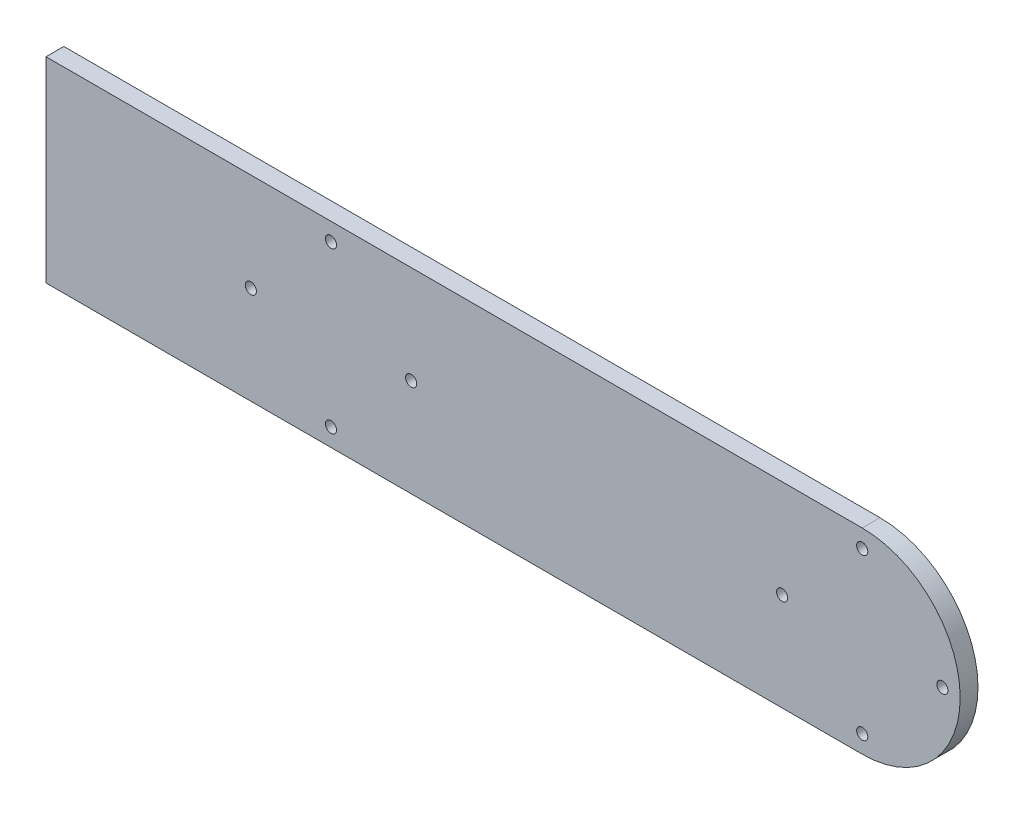
ISO-10303-21;
HEADER;
FILE_DESCRIPTION(('STEP AP214'),'2;1');
FILE_NAME('part.step','',(''),(''),'','','');
FILE_SCHEMA(('AUTOMOTIVE_DESIGN { 1 0 10303 214 1 1 1 1 }'));
ENDSEC;
DATA;
#1=APPLICATION_CONTEXT('core data for automotive mechanical design processes');
#2=APPLICATION_PROTOCOL_DEFINITION('international standard','automotive_design',2000,#1);
#3=PRODUCT_CONTEXT('',#1,'mechanical');
#4=PRODUCT('Part','Part','',(#3));
#5=PRODUCT_RELATED_PRODUCT_CATEGORY('part','',(#4));
#6=PRODUCT_DEFINITION_FORMATION('','',#4);
#7=PRODUCT_DEFINITION_CONTEXT('part definition',#1,'design');
#8=PRODUCT_DEFINITION('design','',#6,#7);
#9=PRODUCT_DEFINITION_SHAPE('','',#8);
#10=(LENGTH_UNIT() NAMED_UNIT(*) SI_UNIT(.MILLI.,.METRE.));
#11=(NAMED_UNIT(*) PLANE_ANGLE_UNIT() SI_UNIT($,.RADIAN.));
#12=(NAMED_UNIT(*) SI_UNIT($,.STERADIAN.) SOLID_ANGLE_UNIT());
#13=UNCERTAINTY_MEASURE_WITH_UNIT(LENGTH_MEASURE(1.E-05),#10,'distance_accuracy_value','');
#14=(GEOMETRIC_REPRESENTATION_CONTEXT(3) GLOBAL_UNCERTAINTY_ASSIGNED_CONTEXT((#13)) GLOBAL_UNIT_ASSIGNED_CONTEXT((#10,
#11,#12)) REPRESENTATION_CONTEXT('',''));
#15=CARTESIAN_POINT('',(0.,0.,0.));
#16=DIRECTION('',(0.,0.,1.));
#17=DIRECTION('',(1.,0.,0.));
#18=AXIS2_PLACEMENT_3D('',#15,#16,#17);
#19=CARTESIAN_POINT('',(0.,0.,5.));
#20=DIRECTION('',(0.,0.,-1.));
#21=DIRECTION('',(-1.,0.,0.));
#22=AXIS2_PLACEMENT_3D('',#19,#20,#21);
#23=PLANE('',#22);
#24=CARTESIAN_POINT('',(0.,0.,5.));
#25=DIRECTION('',(0.,0.,1.));
#26=DIRECTION('',(-1.,0.,0.));
#27=AXIS2_PLACEMENT_3D('',#24,#25,#26);
#28=CIRCLE('',#27,27.5);
#29=CARTESIAN_POINT('',(0.,-27.5,5.));
#30=VERTEX_POINT('',#29);
#31=CARTESIAN_POINT('',(0.,27.5,5.));
#32=VERTEX_POINT('',#31);
#33=EDGE_CURVE('E98',#30,#32,#28,.T.);
#34=ORIENTED_EDGE('',*,*,#33,.T.);
#35=DIRECTION('',(-1.,0.,0.));
#36=VECTOR('',#35,1.);
#37=CARTESIAN_POINT('',(0.,27.5,5.));
#38=LINE('',#37,#36);
#39=CARTESIAN_POINT('',(-229.132053391555,27.5,5.));
#40=VERTEX_POINT('',#39);
#41=EDGE_CURVE('E93',#32,#40,#38,.T.);
#42=ORIENTED_EDGE('',*,*,#41,.T.);
#43=DIRECTION('',(0.,-1.,0.));
#44=VECTOR('',#43,1.);
#45=CARTESIAN_POINT('',(-229.132053391555,27.5,5.));
#46=LINE('',#45,#44);
#47=CARTESIAN_POINT('',(-229.132053391555,-27.5,5.));
#48=VERTEX_POINT('',#47);
#49=EDGE_CURVE('E96',#40,#48,#46,.T.);
#50=ORIENTED_EDGE('',*,*,#49,.T.);
#51=DIRECTION('',(1.,0.,0.));
#52=VECTOR('',#51,1.);
#53=CARTESIAN_POINT('',(-229.132053391555,-27.5,5.));
#54=LINE('',#53,#52);
#55=EDGE_CURVE('E63',#48,#30,#54,.T.);
#56=ORIENTED_EDGE('',*,*,#55,.T.);
#57=EDGE_LOOP('',(#34,#42,#50,#56));
#58=FACE_BOUND('',#57,.T.);
#59=CARTESIAN_POINT('',(0.,22.5,5.));
#60=DIRECTION('',(0.,0.,1.));
#61=DIRECTION('',(1.,0.,0.));
#62=AXIS2_PLACEMENT_3D('',#59,#60,#61);
#63=CIRCLE('',#62,1.5635);
#64=CARTESIAN_POINT('',(1.5635,22.5,5.));
#65=VERTEX_POINT('',#64);
#66=EDGE_CURVE('E118',#65,#65,#63,.T.);
#67=ORIENTED_EDGE('',*,*,#66,.F.);
#68=EDGE_LOOP('',(#67));
#69=FACE_BOUND('',#68,.T.);
#70=CARTESIAN_POINT('',(22.5,0.,5.));
#71=DIRECTION('',(0.,0.,1.));
#72=DIRECTION('',(1.,0.,0.));
#73=AXIS2_PLACEMENT_3D('',#70,#71,#72);
#74=CIRCLE('',#73,1.5635);
#75=CARTESIAN_POINT('',(24.0635,0.,5.));
#76=VERTEX_POINT('',#75);
#77=EDGE_CURVE('E140',#76,#76,#74,.T.);
#78=ORIENTED_EDGE('',*,*,#77,.F.);
#79=EDGE_LOOP('',(#78));
#80=FACE_BOUND('',#79,.T.);
#81=CARTESIAN_POINT('',(0.,-22.5000000000001,5.));
#82=DIRECTION('',(0.,0.,1.));
#83=DIRECTION('',(1.,0.,0.));
#84=AXIS2_PLACEMENT_3D('',#81,#82,#83);
#85=CIRCLE('',#84,1.5635);
#86=CARTESIAN_POINT('',(1.56349999999992,-22.5000000000001,5.));
#87=VERTEX_POINT('',#86);
#88=EDGE_CURVE('E148',#87,#87,#85,.T.);
#89=ORIENTED_EDGE('',*,*,#88,.F.);
#90=EDGE_LOOP('',(#89));
#91=FACE_BOUND('',#90,.T.);
#92=CARTESIAN_POINT('',(-22.5000000000001,0.,5.));
#93=DIRECTION('',(0.,0.,1.));
#94=DIRECTION('',(1.,0.,0.));
#95=AXIS2_PLACEMENT_3D('',#92,#93,#94);
#96=CIRCLE('',#95,1.5635);
#97=CARTESIAN_POINT('',(-20.9365000000001,0.,5.));
#98=VERTEX_POINT('',#97);
#99=EDGE_CURVE('E156',#98,#98,#96,.T.);
#100=ORIENTED_EDGE('',*,*,#99,.F.);
#101=EDGE_LOOP('',(#100));
#102=FACE_BOUND('',#101,.T.);
#103=CARTESIAN_POINT('',(-149.132053391555,22.5,5.));
#104=DIRECTION('',(0.,0.,1.));
#105=DIRECTION('',(1.,0.,0.));
#106=AXIS2_PLACEMENT_3D('',#103,#104,#105);
#107=CIRCLE('',#106,1.5635);
#108=CARTESIAN_POINT('',(-147.568553391555,22.5,5.));
#109=VERTEX_POINT('',#108);
#110=EDGE_CURVE('E164',#109,#109,#107,.T.);
#111=ORIENTED_EDGE('',*,*,#110,.F.);
#112=EDGE_LOOP('',(#111));
#113=FACE_BOUND('',#112,.T.);
#114=CARTESIAN_POINT('',(-126.632053391555,0.,5.));
#115=DIRECTION('',(0.,0.,1.));
#116=DIRECTION('',(1.,0.,0.));
#117=AXIS2_PLACEMENT_3D('',#114,#115,#116);
#118=CIRCLE('',#117,1.5635);
#119=CARTESIAN_POINT('',(-125.068553391555,0.,5.));
#120=VERTEX_POINT('',#119);
#121=EDGE_CURVE('E172',#120,#120,#118,.T.);
#122=ORIENTED_EDGE('',*,*,#121,.F.);
#123=EDGE_LOOP('',(#122));
#124=FACE_BOUND('',#123,.T.);
#125=CARTESIAN_POINT('',(-149.132053391555,-22.5,5.));
#126=DIRECTION('',(0.,0.,1.));
#127=DIRECTION('',(1.,0.,0.));
#128=AXIS2_PLACEMENT_3D('',#125,#126,#127);
#129=CIRCLE('',#128,1.5635);
#130=CARTESIAN_POINT('',(-147.568553391555,-22.5,5.));
#131=VERTEX_POINT('',#130);
#132=EDGE_CURVE('E180',#131,#131,#129,.T.);
#133=ORIENTED_EDGE('',*,*,#132,.F.);
#134=EDGE_LOOP('',(#133));
#135=FACE_BOUND('',#134,.T.);
#136=CARTESIAN_POINT('',(-171.632053391555,0.,5.));
#137=DIRECTION('',(0.,0.,1.));
#138=DIRECTION('',(1.,0.,0.));
#139=AXIS2_PLACEMENT_3D('',#136,#137,#138);
#140=CIRCLE('',#139,1.5635);
#141=CARTESIAN_POINT('',(-170.068553391555,0.,5.));
#142=VERTEX_POINT('',#141);
#143=EDGE_CURVE('E188',#142,#142,#140,.T.);
#144=ORIENTED_EDGE('',*,*,#143,.F.);
#145=EDGE_LOOP('',(#144));
#146=FACE_BOUND('',#145,.T.);
#147=ADVANCED_FACE('F45',(#58,#69,#80,#91,#102,#113,#124,#135,#146),#23,.F.);
#148=CARTESIAN_POINT('',(0.,0.,0.));
#149=DIRECTION('',(0.,0.,-1.));
#150=DIRECTION('',(-1.,0.,0.));
#151=AXIS2_PLACEMENT_3D('',#148,#149,#150);
#152=PLANE('',#151);
#153=CARTESIAN_POINT('',(-149.132053391555,-22.5,0.));
#154=DIRECTION('',(0.,0.,1.));
#155=DIRECTION('',(1.,0.,0.));
#156=AXIS2_PLACEMENT_3D('',#153,#154,#155);
#157=CIRCLE('',#156,1.5635);
#158=CARTESIAN_POINT('',(-147.568553391555,-22.5,0.));
#159=VERTEX_POINT('',#158);
#160=EDGE_CURVE('E184',#159,#159,#157,.T.);
#161=ORIENTED_EDGE('',*,*,#160,.T.);
#162=EDGE_LOOP('',(#161));
#163=FACE_BOUND('',#162,.T.);
#164=CARTESIAN_POINT('',(-149.132053391555,22.5,0.));
#165=DIRECTION('',(0.,0.,1.));
#166=DIRECTION('',(1.,0.,0.));
#167=AXIS2_PLACEMENT_3D('',#164,#165,#166);
#168=CIRCLE('',#167,1.5635);
#169=CARTESIAN_POINT('',(-147.568553391555,22.5,0.));
#170=VERTEX_POINT('',#169);
#171=EDGE_CURVE('E168',#170,#170,#168,.T.);
#172=ORIENTED_EDGE('',*,*,#171,.T.);
#173=EDGE_LOOP('',(#172));
#174=FACE_BOUND('',#173,.T.);
#175=CARTESIAN_POINT('',(0.,-22.5000000000001,0.));
#176=DIRECTION('',(0.,0.,1.));
#177=DIRECTION('',(1.,0.,0.));
#178=AXIS2_PLACEMENT_3D('',#175,#176,#177);
#179=CIRCLE('',#178,1.5635);
#180=CARTESIAN_POINT('',(1.56349999999992,-22.5000000000001,0.));
#181=VERTEX_POINT('',#180);
#182=EDGE_CURVE('E152',#181,#181,#179,.T.);
#183=ORIENTED_EDGE('',*,*,#182,.T.);
#184=EDGE_LOOP('',(#183));
#185=FACE_BOUND('',#184,.T.);
#186=CARTESIAN_POINT('',(0.,22.5,0.));
#187=DIRECTION('',(0.,0.,1.));
#188=DIRECTION('',(1.,0.,0.));
#189=AXIS2_PLACEMENT_3D('',#186,#187,#188);
#190=CIRCLE('',#189,1.5635);
#191=CARTESIAN_POINT('',(1.5635,22.5,0.));
#192=VERTEX_POINT('',#191);
#193=EDGE_CURVE('E136',#192,#192,#190,.T.);
#194=ORIENTED_EDGE('',*,*,#193,.T.);
#195=EDGE_LOOP('',(#194));
#196=FACE_BOUND('',#195,.T.);
#197=CARTESIAN_POINT('',(0.,0.,0.));
#198=DIRECTION('',(0.,0.,1.));
#199=DIRECTION('',(-1.,0.,0.));
#200=AXIS2_PLACEMENT_3D('',#197,#198,#199);
#201=CIRCLE('',#200,27.5);
#202=CARTESIAN_POINT('',(0.,-27.5,0.));
#203=VERTEX_POINT('',#202);
#204=CARTESIAN_POINT('',(0.,27.5,0.));
#205=VERTEX_POINT('',#204);
#206=EDGE_CURVE('E114',#203,#205,#201,.T.);
#207=ORIENTED_EDGE('',*,*,#206,.F.);
#208=DIRECTION('',(1.,0.,0.));
#209=VECTOR('',#208,1.);
#210=CARTESIAN_POINT('',(-229.132053391555,-27.5,0.));
#211=LINE('',#210,#209);
#212=CARTESIAN_POINT('',(-229.132053391555,-27.5,0.));
#213=VERTEX_POINT('',#212);
#214=EDGE_CURVE('E86',#213,#203,#211,.T.);
#215=ORIENTED_EDGE('',*,*,#214,.F.);
#216=DIRECTION('',(0.,-1.,0.));
#217=VECTOR('',#216,1.);
#218=CARTESIAN_POINT('',(-229.132053391555,27.5,0.));
#219=LINE('',#218,#217);
#220=CARTESIAN_POINT('',(-229.132053391555,27.5,0.));
#221=VERTEX_POINT('',#220);
#222=EDGE_CURVE('E80',#221,#213,#219,.T.);
#223=ORIENTED_EDGE('',*,*,#222,.F.);
#224=DIRECTION('',(-1.,0.,0.));
#225=VECTOR('',#224,1.);
#226=CARTESIAN_POINT('',(0.,27.5,0.));
#227=LINE('',#226,#225);
#228=EDGE_CURVE('E103',#205,#221,#227,.T.);
#229=ORIENTED_EDGE('',*,*,#228,.F.);
#230=EDGE_LOOP('',(#207,#215,#223,#229));
#231=FACE_BOUND('',#230,.T.);
#232=CARTESIAN_POINT('',(22.5,0.,0.));
#233=DIRECTION('',(0.,0.,1.));
#234=DIRECTION('',(1.,0.,0.));
#235=AXIS2_PLACEMENT_3D('',#232,#233,#234);
#236=CIRCLE('',#235,1.5635);
#237=CARTESIAN_POINT('',(24.0635,0.,0.));
#238=VERTEX_POINT('',#237);
#239=EDGE_CURVE('E144',#238,#238,#236,.T.);
#240=ORIENTED_EDGE('',*,*,#239,.T.);
#241=EDGE_LOOP('',(#240));
#242=FACE_BOUND('',#241,.T.);
#243=CARTESIAN_POINT('',(-22.5000000000001,0.,0.));
#244=DIRECTION('',(0.,0.,1.));
#245=DIRECTION('',(1.,0.,0.));
#246=AXIS2_PLACEMENT_3D('',#243,#244,#245);
#247=CIRCLE('',#246,1.5635);
#248=CARTESIAN_POINT('',(-20.9365000000001,0.,0.));
#249=VERTEX_POINT('',#248);
#250=EDGE_CURVE('E160',#249,#249,#247,.T.);
#251=ORIENTED_EDGE('',*,*,#250,.T.);
#252=EDGE_LOOP('',(#251));
#253=FACE_BOUND('',#252,.T.);
#254=CARTESIAN_POINT('',(-126.632053391555,0.,0.));
#255=DIRECTION('',(0.,0.,1.));
#256=DIRECTION('',(1.,0.,0.));
#257=AXIS2_PLACEMENT_3D('',#254,#255,#256);
#258=CIRCLE('',#257,1.5635);
#259=CARTESIAN_POINT('',(-125.068553391555,0.,0.));
#260=VERTEX_POINT('',#259);
#261=EDGE_CURVE('E176',#260,#260,#258,.T.);
#262=ORIENTED_EDGE('',*,*,#261,.T.);
#263=EDGE_LOOP('',(#262));
#264=FACE_BOUND('',#263,.T.);
#265=CARTESIAN_POINT('',(-171.632053391555,0.,0.));
#266=DIRECTION('',(0.,0.,1.));
#267=DIRECTION('',(1.,0.,0.));
#268=AXIS2_PLACEMENT_3D('',#265,#266,#267);
#269=CIRCLE('',#268,1.5635);
#270=CARTESIAN_POINT('',(-170.068553391555,0.,0.));
#271=VERTEX_POINT('',#270);
#272=EDGE_CURVE('E192',#271,#271,#269,.T.);
#273=ORIENTED_EDGE('',*,*,#272,.T.);
#274=EDGE_LOOP('',(#273));
#275=FACE_BOUND('',#274,.T.);
#276=ADVANCED_FACE('F131',(#163,#174,#185,#196,#231,#242,#253,#264,#275),#152,.T.);
#277=CARTESIAN_POINT('',(0.,0.,5.));
#278=DIRECTION('',(0.,0.,-1.));
#279=DIRECTION('',(-1.,0.,0.));
#280=AXIS2_PLACEMENT_3D('',#277,#278,#279);
#281=CYLINDRICAL_SURFACE('',#280,27.5);
#282=ORIENTED_EDGE('',*,*,#206,.T.);
#283=DIRECTION('',(0.,0.,-1.));
#284=VECTOR('',#283,1.);
#285=CARTESIAN_POINT('',(0.,27.5,5.));
#286=LINE('',#285,#284);
#287=EDGE_CURVE('E11',#32,#205,#286,.T.);
#288=ORIENTED_EDGE('',*,*,#287,.F.);
#289=ORIENTED_EDGE('',*,*,#33,.F.);
#290=DIRECTION('',(0.,0.,-1.));
#291=VECTOR('',#290,1.);
#292=CARTESIAN_POINT('',(0.,-27.5,5.));
#293=LINE('',#292,#291);
#294=EDGE_CURVE('E110',#30,#203,#293,.T.);
#295=ORIENTED_EDGE('',*,*,#294,.T.);
#296=EDGE_LOOP('',(#282,#288,#289,#295));
#297=FACE_BOUND('',#296,.T.);
#298=ADVANCED_FACE('F47',(#297),#281,.T.);
#299=CARTESIAN_POINT('',(0.,27.5,5.));
#300=DIRECTION('',(0.,-1.,0.));
#301=DIRECTION('',(1.,0.,0.));
#302=AXIS2_PLACEMENT_3D('',#299,#300,#301);
#303=PLANE('',#302);
#304=ORIENTED_EDGE('',*,*,#228,.T.);
#305=DIRECTION('',(0.,0.,-1.));
#306=VECTOR('',#305,1.);
#307=CARTESIAN_POINT('',(-229.132053391555,27.5,5.));
#308=LINE('',#307,#306);
#309=EDGE_CURVE('E55',#40,#221,#308,.T.);
#310=ORIENTED_EDGE('',*,*,#309,.F.);
#311=ORIENTED_EDGE('',*,*,#41,.F.);
#312=ORIENTED_EDGE('',*,*,#287,.T.);
#313=EDGE_LOOP('',(#304,#310,#311,#312));
#314=FACE_BOUND('',#313,.T.);
#315=ADVANCED_FACE('F102',(#314),#303,.F.);
#316=CARTESIAN_POINT('',(-229.132053391555,27.5,5.));
#317=DIRECTION('',(1.,0.,0.));
#318=DIRECTION('',(0.,0.,-1.));
#319=AXIS2_PLACEMENT_3D('',#316,#317,#318);
#320=PLANE('',#319);
#321=ORIENTED_EDGE('',*,*,#222,.T.);
#322=DIRECTION('',(0.,0.,-1.));
#323=VECTOR('',#322,1.);
#324=CARTESIAN_POINT('',(-229.132053391555,-27.5,5.));
#325=LINE('',#324,#323);
#326=EDGE_CURVE('E105',#48,#213,#325,.T.);
#327=ORIENTED_EDGE('',*,*,#326,.F.);
#328=ORIENTED_EDGE('',*,*,#49,.F.);
#329=ORIENTED_EDGE('',*,*,#309,.T.);
#330=EDGE_LOOP('',(#321,#327,#328,#329));
#331=FACE_BOUND('',#330,.T.);
#332=ADVANCED_FACE('F106',(#331),#320,.F.);
#333=CARTESIAN_POINT('',(-229.132053391555,-27.5,5.));
#334=DIRECTION('',(0.,1.,0.));
#335=DIRECTION('',(0.,0.,1.));
#336=AXIS2_PLACEMENT_3D('',#333,#334,#335);
#337=PLANE('',#336);
#338=ORIENTED_EDGE('',*,*,#214,.T.);
#339=ORIENTED_EDGE('',*,*,#294,.F.);
#340=ORIENTED_EDGE('',*,*,#55,.F.);
#341=ORIENTED_EDGE('',*,*,#326,.T.);
#342=EDGE_LOOP('',(#338,#339,#340,#341));
#343=FACE_BOUND('',#342,.T.);
#344=ADVANCED_FACE('F128',(#343),#337,.F.);
#345=CARTESIAN_POINT('',(0.,22.5,5.));
#346=DIRECTION('',(0.,0.,-1.));
#347=DIRECTION('',(-1.,0.,0.));
#348=AXIS2_PLACEMENT_3D('',#345,#346,#347);
#349=CYLINDRICAL_SURFACE('',#348,1.5635);
#350=ORIENTED_EDGE('',*,*,#66,.T.);
#351=EDGE_LOOP('',(#350));
#352=FACE_BOUND('',#351,.T.);
#353=ORIENTED_EDGE('',*,*,#193,.F.);
#354=EDGE_LOOP('',(#353));
#355=FACE_BOUND('',#354,.T.);
#356=ADVANCED_FACE('F211',(#352,#355),#349,.F.);
#357=CARTESIAN_POINT('',(22.5,0.,5.));
#358=DIRECTION('',(0.,0.,-1.));
#359=DIRECTION('',(-1.,0.,0.));
#360=AXIS2_PLACEMENT_3D('',#357,#358,#359);
#361=CYLINDRICAL_SURFACE('',#360,1.5635);
#362=ORIENTED_EDGE('',*,*,#77,.T.);
#363=EDGE_LOOP('',(#362));
#364=FACE_BOUND('',#363,.T.);
#365=ORIENTED_EDGE('',*,*,#239,.F.);
#366=EDGE_LOOP('',(#365));
#367=FACE_BOUND('',#366,.T.);
#368=ADVANCED_FACE('F256',(#364,#367),#361,.F.);
#369=CARTESIAN_POINT('',(0.,-22.5000000000001,5.));
#370=DIRECTION('',(0.,0.,-1.));
#371=DIRECTION('',(-1.,0.,0.));
#372=AXIS2_PLACEMENT_3D('',#369,#370,#371);
#373=CYLINDRICAL_SURFACE('',#372,1.5635);
#374=ORIENTED_EDGE('',*,*,#88,.T.);
#375=EDGE_LOOP('',(#374));
#376=FACE_BOUND('',#375,.T.);
#377=ORIENTED_EDGE('',*,*,#182,.F.);
#378=EDGE_LOOP('',(#377));
#379=FACE_BOUND('',#378,.T.);
#380=ADVANCED_FACE('F264',(#376,#379),#373,.F.);
#381=CARTESIAN_POINT('',(-22.5000000000001,0.,5.));
#382=DIRECTION('',(0.,0.,-1.));
#383=DIRECTION('',(-1.,0.,0.));
#384=AXIS2_PLACEMENT_3D('',#381,#382,#383);
#385=CYLINDRICAL_SURFACE('',#384,1.5635);
#386=ORIENTED_EDGE('',*,*,#99,.T.);
#387=EDGE_LOOP('',(#386));
#388=FACE_BOUND('',#387,.T.);
#389=ORIENTED_EDGE('',*,*,#250,.F.);
#390=EDGE_LOOP('',(#389));
#391=FACE_BOUND('',#390,.T.);
#392=ADVANCED_FACE('F272',(#388,#391),#385,.F.);
#393=CARTESIAN_POINT('',(-149.132053391555,22.5,5.));
#394=DIRECTION('',(0.,0.,-1.));
#395=DIRECTION('',(-1.,0.,0.));
#396=AXIS2_PLACEMENT_3D('',#393,#394,#395);
#397=CYLINDRICAL_SURFACE('',#396,1.5635);
#398=ORIENTED_EDGE('',*,*,#110,.T.);
#399=EDGE_LOOP('',(#398));
#400=FACE_BOUND('',#399,.T.);
#401=ORIENTED_EDGE('',*,*,#171,.F.);
#402=EDGE_LOOP('',(#401));
#403=FACE_BOUND('',#402,.T.);
#404=ADVANCED_FACE('F281',(#400,#403),#397,.F.);
#405=CARTESIAN_POINT('',(-126.632053391555,0.,5.));
#406=DIRECTION('',(0.,0.,-1.));
#407=DIRECTION('',(-1.,0.,0.));
#408=AXIS2_PLACEMENT_3D('',#405,#406,#407);
#409=CYLINDRICAL_SURFACE('',#408,1.5635);
#410=ORIENTED_EDGE('',*,*,#121,.T.);
#411=EDGE_LOOP('',(#410));
#412=FACE_BOUND('',#411,.T.);
#413=ORIENTED_EDGE('',*,*,#261,.F.);
#414=EDGE_LOOP('',(#413));
#415=FACE_BOUND('',#414,.T.);
#416=ADVANCED_FACE('F290',(#412,#415),#409,.F.);
#417=CARTESIAN_POINT('',(-149.132053391555,-22.5,5.));
#418=DIRECTION('',(0.,0.,-1.));
#419=DIRECTION('',(-1.,0.,0.));
#420=AXIS2_PLACEMENT_3D('',#417,#418,#419);
#421=CYLINDRICAL_SURFACE('',#420,1.5635);
#422=ORIENTED_EDGE('',*,*,#132,.T.);
#423=EDGE_LOOP('',(#422));
#424=FACE_BOUND('',#423,.T.);
#425=ORIENTED_EDGE('',*,*,#160,.F.);
#426=EDGE_LOOP('',(#425));
#427=FACE_BOUND('',#426,.T.);
#428=ADVANCED_FACE('F299',(#424,#427),#421,.F.);
#429=CARTESIAN_POINT('',(-171.632053391555,0.,5.));
#430=DIRECTION('',(0.,0.,-1.));
#431=DIRECTION('',(-1.,0.,0.));
#432=AXIS2_PLACEMENT_3D('',#429,#430,#431);
#433=CYLINDRICAL_SURFACE('',#432,1.5635);
#434=ORIENTED_EDGE('',*,*,#143,.T.);
#435=EDGE_LOOP('',(#434));
#436=FACE_BOUND('',#435,.T.);
#437=ORIENTED_EDGE('',*,*,#272,.F.);
#438=EDGE_LOOP('',(#437));
#439=FACE_BOUND('',#438,.T.);
#440=ADVANCED_FACE('F200',(#436,#439),#433,.F.);
#441=CLOSED_SHELL('',(#147,#276,#298,#315,#332,#344,#356,#368,#380,#392,#404,#416,#428,#440));
#442=MANIFOLD_SOLID_BREP('B2',#441);
#443=ADVANCED_BREP_SHAPE_REPRESENTATION('',(#18,#442),#14);
#444=SHAPE_DEFINITION_REPRESENTATION(#9,#443);
ENDSEC;
END-ISO-10303-21;
